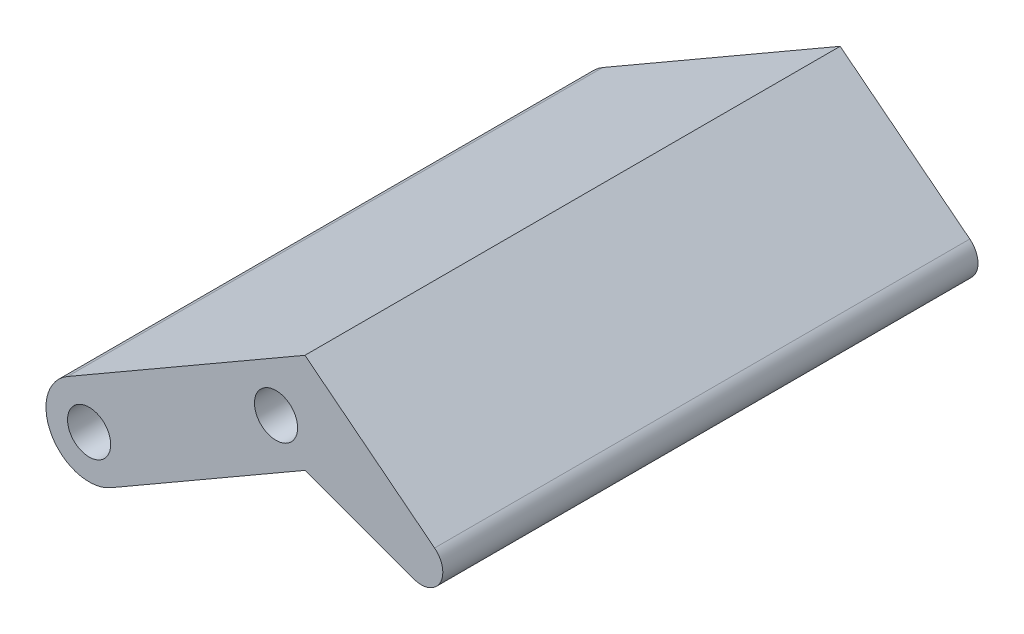
ISO-10303-21;
HEADER;
FILE_DESCRIPTION(('STEP AP214'),'2;1');
FILE_NAME('part.step','',(''),(''),'','','');
FILE_SCHEMA(('AUTOMOTIVE_DESIGN { 1 0 10303 214 1 1 1 1 }'));
ENDSEC;
DATA;
#1=APPLICATION_CONTEXT('core data for automotive mechanical design processes');
#2=APPLICATION_PROTOCOL_DEFINITION('international standard','automotive_design',2000,#1);
#3=PRODUCT_CONTEXT('',#1,'mechanical');
#4=PRODUCT('Part','Part','',(#3));
#5=PRODUCT_RELATED_PRODUCT_CATEGORY('part','',(#4));
#6=PRODUCT_DEFINITION_FORMATION('','',#4);
#7=PRODUCT_DEFINITION_CONTEXT('part definition',#1,'design');
#8=PRODUCT_DEFINITION('design','',#6,#7);
#9=PRODUCT_DEFINITION_SHAPE('','',#8);
#10=(LENGTH_UNIT() NAMED_UNIT(*) SI_UNIT(.MILLI.,.METRE.));
#11=(NAMED_UNIT(*) PLANE_ANGLE_UNIT() SI_UNIT($,.RADIAN.));
#12=(NAMED_UNIT(*) SI_UNIT($,.STERADIAN.) SOLID_ANGLE_UNIT());
#13=UNCERTAINTY_MEASURE_WITH_UNIT(LENGTH_MEASURE(1.E-05),#10,'distance_accuracy_value','');
#14=(GEOMETRIC_REPRESENTATION_CONTEXT(3) GLOBAL_UNCERTAINTY_ASSIGNED_CONTEXT((#13)) GLOBAL_UNIT_ASSIGNED_CONTEXT((#10,
#11,#12)) REPRESENTATION_CONTEXT('',''));
#15=CARTESIAN_POINT('',(0.,0.,0.));
#16=DIRECTION('',(0.,0.,1.));
#17=DIRECTION('',(1.,0.,0.));
#18=AXIS2_PLACEMENT_3D('',#15,#16,#17);
#19=CARTESIAN_POINT('',(-10.,40.7122492960801,70.));
#20=DIRECTION('',(0.,0.,-1.));
#21=DIRECTION('',(0.,1.,0.));
#22=AXIS2_PLACEMENT_3D('',#19,#20,#21);
#23=CYLINDRICAL_SURFACE('',#22,2.5);
#24=CARTESIAN_POINT('',(-10.,40.7122492960801,65.));
#25=DIRECTION('',(0.,0.,-1.));
#26=DIRECTION('',(0.,1.,0.));
#27=AXIS2_PLACEMENT_3D('',#24,#25,#26);
#28=CIRCLE('',#27,2.5);
#29=CARTESIAN_POINT('',(-10.,43.2122492960801,65.));
#30=VERTEX_POINT('',#29);
#31=EDGE_CURVE('E149',#30,#30,#28,.F.);
#32=ORIENTED_EDGE('',*,*,#31,.T.);
#33=EDGE_LOOP('',(#32));
#34=FACE_BOUND('',#33,.T.);
#35=CARTESIAN_POINT('',(-10.,40.71224929608,3.00000000000001));
#36=DIRECTION('',(0.,0.,-1.));
#37=DIRECTION('',(0.,1.,0.));
#38=AXIS2_PLACEMENT_3D('',#35,#36,#37);
#39=CIRCLE('',#38,2.5);
#40=CARTESIAN_POINT('',(-10.,43.2122492960801,3.00000000000001));
#41=VERTEX_POINT('',#40);
#42=EDGE_CURVE('E138',#41,#41,#39,.T.);
#43=ORIENTED_EDGE('',*,*,#42,.T.);
#44=EDGE_LOOP('',(#43));
#45=FACE_BOUND('',#44,.T.);
#46=ADVANCED_FACE('F63',(#34,#45),#23,.F.);
#47=CARTESIAN_POINT('',(11.650635094611,53.2122492960801,70.));
#48=DIRECTION('',(0.,0.,-1.));
#49=DIRECTION('',(0.,1.,0.));
#50=AXIS2_PLACEMENT_3D('',#47,#48,#49);
#51=CYLINDRICAL_SURFACE('',#50,2.5);
#52=CARTESIAN_POINT('',(11.650635094611,53.2122492960801,65.));
#53=DIRECTION('',(0.,0.,-1.));
#54=DIRECTION('',(0.,1.,0.));
#55=AXIS2_PLACEMENT_3D('',#52,#53,#54);
#56=CIRCLE('',#55,2.5);
#57=CARTESIAN_POINT('',(11.650635094611,55.7122492960801,65.));
#58=VERTEX_POINT('',#57);
#59=EDGE_CURVE('E119',#58,#58,#56,.F.);
#60=ORIENTED_EDGE('',*,*,#59,.T.);
#61=EDGE_LOOP('',(#60));
#62=FACE_BOUND('',#61,.T.);
#63=CARTESIAN_POINT('',(11.650635094611,53.21224929608,3.00000000000001));
#64=DIRECTION('',(0.,0.,-1.));
#65=DIRECTION('',(0.,1.,0.));
#66=AXIS2_PLACEMENT_3D('',#63,#64,#65);
#67=CIRCLE('',#66,2.5);
#68=CARTESIAN_POINT('',(11.650635094611,55.71224929608,3.00000000000001));
#69=VERTEX_POINT('',#68);
#70=EDGE_CURVE('E135',#69,#69,#67,.T.);
#71=ORIENTED_EDGE('',*,*,#70,.T.);
#72=EDGE_LOOP('',(#71));
#73=FACE_BOUND('',#72,.T.);
#74=ADVANCED_FACE('F196',(#62,#73),#51,.F.);
#75=CARTESIAN_POINT('',(28.4709591202086,47.1299196183413,-47.4283798145774));
#76=DIRECTION('',(0.,0.,1.));
#77=DIRECTION('',(0.,-1.,0.));
#78=AXIS2_PLACEMENT_3D('',#75,#76,#77);
#79=CYLINDRICAL_SURFACE('',#78,2.5);
#80=DIRECTION('',(0.,0.,1.));
#81=VECTOR('',#80,1.);
#82=CARTESIAN_POINT('',(27.6159087618944,44.7806880663766,-47.4283798145774));
#83=LINE('',#82,#81);
#84=CARTESIAN_POINT('',(27.6159087618944,44.7806880663766,3.00000000000001));
#85=VERTEX_POINT('',#84);
#86=CARTESIAN_POINT('',(27.6159087618944,44.7806880663766,65.));
#87=VERTEX_POINT('',#86);
#88=EDGE_CURVE('E109',#85,#87,#83,.T.);
#89=ORIENTED_EDGE('',*,*,#88,.F.);
#90=CARTESIAN_POINT('',(28.4709591202086,47.1299196183413,3.00000000000001));
#91=DIRECTION('',(0.,0.,-1.));
#92=DIRECTION('',(0.,1.,0.));
#93=AXIS2_PLACEMENT_3D('',#90,#91,#92);
#94=CIRCLE('',#93,2.5);
#95=CARTESIAN_POINT('',(30.0176059278044,49.094069218691,3.00000000000001));
#96=VERTEX_POINT('',#95);
#97=EDGE_CURVE('E113',#96,#85,#94,.T.);
#98=ORIENTED_EDGE('',*,*,#97,.F.);
#99=DIRECTION('',(0.,0.,1.));
#100=VECTOR('',#99,1.);
#101=CARTESIAN_POINT('',(30.0176059278044,49.094069218691,-47.4283798145774));
#102=LINE('',#101,#100);
#103=CARTESIAN_POINT('',(30.0176059278044,49.094069218691,65.));
#104=VERTEX_POINT('',#103);
#105=EDGE_CURVE('E78',#96,#104,#102,.T.);
#106=ORIENTED_EDGE('',*,*,#105,.T.);
#107=CARTESIAN_POINT('',(28.4709591202086,47.1299196183414,65.));
#108=DIRECTION('',(0.,0.,-1.));
#109=DIRECTION('',(0.,1.,0.));
#110=AXIS2_PLACEMENT_3D('',#107,#108,#109);
#111=CIRCLE('',#110,2.5);
#112=EDGE_CURVE('E114',#104,#87,#111,.T.);
#113=ORIENTED_EDGE('',*,*,#112,.T.);
#114=EDGE_LOOP('',(#89,#98,#106,#113));
#115=FACE_BOUND('',#114,.T.);
#116=ADVANCED_FACE('F111',(#115),#79,.T.);
#117=CARTESIAN_POINT('',(27.6159087618944,44.7806880663766,-47.4283798145774));
#118=DIRECTION('',(0.342020143325672,0.939692620785907,0.));
#119=DIRECTION('',(-0.939692620785907,0.342020143325672,0.));
#120=AXIS2_PLACEMENT_3D('',#117,#118,#119);
#121=PLANE('',#120);
#122=DIRECTION('',(0.,0.,1.));
#123=VECTOR('',#122,1.);
#124=CARTESIAN_POINT('',(15.,49.3725033339243,-47.4283798145774));
#125=LINE('',#124,#123);
#126=CARTESIAN_POINT('',(15.,49.3725033339244,3.00000000000001));
#127=VERTEX_POINT('',#126);
#128=CARTESIAN_POINT('',(15.,49.3725033339244,65.));
#129=VERTEX_POINT('',#128);
#130=EDGE_CURVE('E123',#127,#129,#125,.T.);
#131=ORIENTED_EDGE('',*,*,#130,.F.);
#132=DIRECTION('',(-0.939692620785907,0.342020143325672,0.));
#133=VECTOR('',#132,1.);
#134=CARTESIAN_POINT('',(27.6159087618944,44.7806880663766,3.00000000000001));
#135=LINE('',#134,#133);
#136=EDGE_CURVE('E121',#85,#127,#135,.T.);
#137=ORIENTED_EDGE('',*,*,#136,.F.);
#138=ORIENTED_EDGE('',*,*,#88,.T.);
#139=DIRECTION('',(-0.939692620785907,0.342020143325672,0.));
#140=VECTOR('',#139,1.);
#141=CARTESIAN_POINT('',(27.6159087618944,44.7806880663766,65.));
#142=LINE('',#141,#140);
#143=EDGE_CURVE('E118',#87,#129,#142,.T.);
#144=ORIENTED_EDGE('',*,*,#143,.T.);
#145=EDGE_LOOP('',(#131,#137,#138,#144));
#146=FACE_BOUND('',#145,.T.);
#147=ADVANCED_FACE('F65',(#146),#121,.F.);
#148=CARTESIAN_POINT('',(-10.,40.7122492960801,65.));
#149=DIRECTION('',(0.,0.,-1.));
#150=DIRECTION('',(0.,1.,0.));
#151=AXIS2_PLACEMENT_3D('',#148,#149,#150);
#152=PLANE('',#151);
#153=DIRECTION('',(-0.785659840139859,0.618658723038326,0.));
#154=VECTOR('',#153,1.);
#155=CARTESIAN_POINT('',(30.0176059278044,49.094069218691,65.));
#156=LINE('',#155,#154);
#157=CARTESIAN_POINT('',(15.,60.9195087177169,65.));
#158=VERTEX_POINT('',#157);
#159=EDGE_CURVE('E155',#104,#158,#156,.T.);
#160=ORIENTED_EDGE('',*,*,#159,.T.);
#161=DIRECTION('',(-0.86602540378444,-0.499999999999998,0.));
#162=VECTOR('',#161,1.);
#163=CARTESIAN_POINT('',(15.,60.9195087177169,65.));
#164=LINE('',#163,#162);
#165=CARTESIAN_POINT('',(-12.5,45.0423763150023,65.));
#166=VERTEX_POINT('',#165);
#167=EDGE_CURVE('E72',#158,#166,#164,.T.);
#168=ORIENTED_EDGE('',*,*,#167,.T.);
#169=CARTESIAN_POINT('',(-10.,40.7122492960801,65.));
#170=DIRECTION('',(0.,0.,-1.));
#171=DIRECTION('',(0.,1.,0.));
#172=AXIS2_PLACEMENT_3D('',#169,#170,#171);
#173=CIRCLE('',#172,5.);
#174=CARTESIAN_POINT('',(-7.50000000000003,36.3821222771579,65.));
#175=VERTEX_POINT('',#174);
#176=EDGE_CURVE('E12',#166,#175,#173,.F.);
#177=ORIENTED_EDGE('',*,*,#176,.T.);
#178=DIRECTION('',(-0.86602540378444,-0.499999999999997,0.));
#179=VECTOR('',#178,1.);
#180=CARTESIAN_POINT('',(15.,49.3725033339244,65.));
#181=LINE('',#180,#179);
#182=EDGE_CURVE('E159',#129,#175,#181,.T.);
#183=ORIENTED_EDGE('',*,*,#182,.F.);
#184=ORIENTED_EDGE('',*,*,#143,.F.);
#185=ORIENTED_EDGE('',*,*,#112,.F.);
#186=EDGE_LOOP('',(#160,#168,#177,#183,#184,#185));
#187=FACE_BOUND('',#186,.T.);
#188=ORIENTED_EDGE('',*,*,#59,.F.);
#189=EDGE_LOOP('',(#188));
#190=FACE_BOUND('',#189,.T.);
#191=ORIENTED_EDGE('',*,*,#31,.F.);
#192=EDGE_LOOP('',(#191));
#193=FACE_BOUND('',#192,.T.);
#194=ADVANCED_FACE('F181',(#187,#190,#193),#152,.F.);
#195=CARTESIAN_POINT('',(30.0176059278044,49.094069218691,-47.4283798145774));
#196=DIRECTION('',(0.618658723038326,0.785659840139859,0.));
#197=DIRECTION('',(-0.785659840139859,0.618658723038326,0.));
#198=AXIS2_PLACEMENT_3D('',#195,#196,#197);
#199=PLANE('',#198);
#200=ORIENTED_EDGE('',*,*,#105,.F.);
#201=DIRECTION('',(0.785659840139859,-0.618658723038326,0.));
#202=VECTOR('',#201,1.);
#203=CARTESIAN_POINT('',(15.,60.9195087177169,3.00000000000001));
#204=LINE('',#203,#202);
#205=CARTESIAN_POINT('',(15.,60.9195087177169,3.00000000000001));
#206=VERTEX_POINT('',#205);
#207=EDGE_CURVE('E134',#206,#96,#204,.T.);
#208=ORIENTED_EDGE('',*,*,#207,.F.);
#209=DIRECTION('',(0.,0.,1.));
#210=VECTOR('',#209,1.);
#211=CARTESIAN_POINT('',(15.,60.9195087177169,-47.4283798145774));
#212=LINE('',#211,#210);
#213=EDGE_CURVE('E170',#206,#158,#212,.T.);
#214=ORIENTED_EDGE('',*,*,#213,.T.);
#215=ORIENTED_EDGE('',*,*,#159,.F.);
#216=EDGE_LOOP('',(#200,#208,#214,#215));
#217=FACE_BOUND('',#216,.T.);
#218=ADVANCED_FACE('F175',(#217),#199,.T.);
#219=CARTESIAN_POINT('',(15.,60.9195087177169,-47.4283798145774));
#220=DIRECTION('',(-0.499999999999998,0.86602540378444,0.));
#221=DIRECTION('',(-0.86602540378444,-0.499999999999998,0.));
#222=AXIS2_PLACEMENT_3D('',#219,#220,#221);
#223=PLANE('',#222);
#224=ORIENTED_EDGE('',*,*,#213,.F.);
#225=DIRECTION('',(0.86602540378444,0.499999999999998,0.));
#226=VECTOR('',#225,1.);
#227=CARTESIAN_POINT('',(-12.5,45.0423763150023,3.00000000000001));
#228=LINE('',#227,#226);
#229=CARTESIAN_POINT('',(-12.5,45.0423763150023,3.00000000000001));
#230=VERTEX_POINT('',#229);
#231=EDGE_CURVE('E146',#230,#206,#228,.T.);
#232=ORIENTED_EDGE('',*,*,#231,.F.);
#233=DIRECTION('',(0.,0.,1.));
#234=VECTOR('',#233,1.);
#235=CARTESIAN_POINT('',(-12.5,45.0423763150022,-47.4283798145774));
#236=LINE('',#235,#234);
#237=EDGE_CURVE('E167',#230,#166,#236,.T.);
#238=ORIENTED_EDGE('',*,*,#237,.T.);
#239=ORIENTED_EDGE('',*,*,#167,.F.);
#240=EDGE_LOOP('',(#224,#232,#238,#239));
#241=FACE_BOUND('',#240,.T.);
#242=ADVANCED_FACE('F178',(#241),#223,.T.);
#243=CARTESIAN_POINT('',(-10.,40.71224929608,-47.4283798145774));
#244=DIRECTION('',(0.,0.,1.));
#245=DIRECTION('',(0.,-1.,0.));
#246=AXIS2_PLACEMENT_3D('',#243,#244,#245);
#247=CYLINDRICAL_SURFACE('',#246,5.);
#248=ORIENTED_EDGE('',*,*,#237,.F.);
#249=CARTESIAN_POINT('',(-10.,40.71224929608,3.00000000000001));
#250=DIRECTION('',(0.,0.,-1.));
#251=DIRECTION('',(0.,1.,0.));
#252=AXIS2_PLACEMENT_3D('',#249,#250,#251);
#253=CIRCLE('',#252,5.);
#254=CARTESIAN_POINT('',(-7.50000000000003,36.3821222771578,3.00000000000001));
#255=VERTEX_POINT('',#254);
#256=EDGE_CURVE('E143',#255,#230,#253,.T.);
#257=ORIENTED_EDGE('',*,*,#256,.F.);
#258=DIRECTION('',(0.,0.,1.));
#259=VECTOR('',#258,1.);
#260=CARTESIAN_POINT('',(-7.50000000000003,36.3821222771578,-47.4283798145774));
#261=LINE('',#260,#259);
#262=EDGE_CURVE('E162',#255,#175,#261,.T.);
#263=ORIENTED_EDGE('',*,*,#262,.T.);
#264=ORIENTED_EDGE('',*,*,#176,.F.);
#265=EDGE_LOOP('',(#248,#257,#263,#264));
#266=FACE_BOUND('',#265,.T.);
#267=ADVANCED_FACE('F187',(#266),#247,.T.);
#268=CARTESIAN_POINT('',(15.,49.3725033339243,-47.4283798145774));
#269=DIRECTION('',(-0.499999999999997,0.86602540378444,0.));
#270=DIRECTION('',(-0.86602540378444,-0.499999999999997,0.));
#271=AXIS2_PLACEMENT_3D('',#268,#269,#270);
#272=PLANE('',#271);
#273=ORIENTED_EDGE('',*,*,#262,.F.);
#274=DIRECTION('',(-0.86602540378444,-0.499999999999998,0.));
#275=VECTOR('',#274,1.);
#276=CARTESIAN_POINT('',(15.,49.3725033339244,3.00000000000001));
#277=LINE('',#276,#275);
#278=EDGE_CURVE('E127',#127,#255,#277,.T.);
#279=ORIENTED_EDGE('',*,*,#278,.F.);
#280=ORIENTED_EDGE('',*,*,#130,.T.);
#281=ORIENTED_EDGE('',*,*,#182,.T.);
#282=EDGE_LOOP('',(#273,#279,#280,#281));
#283=FACE_BOUND('',#282,.T.);
#284=ADVANCED_FACE('F184',(#283),#272,.F.);
#285=CARTESIAN_POINT('',(28.4709591202086,47.1299196183413,3.00000000000001));
#286=DIRECTION('',(0.,0.,-1.));
#287=DIRECTION('',(0.,1.,0.));
#288=AXIS2_PLACEMENT_3D('',#285,#286,#287);
#289=PLANE('',#288);
#290=ORIENTED_EDGE('',*,*,#70,.F.);
#291=EDGE_LOOP('',(#290));
#292=FACE_BOUND('',#291,.T.);
#293=ORIENTED_EDGE('',*,*,#97,.T.);
#294=ORIENTED_EDGE('',*,*,#136,.T.);
#295=ORIENTED_EDGE('',*,*,#278,.T.);
#296=ORIENTED_EDGE('',*,*,#256,.T.);
#297=ORIENTED_EDGE('',*,*,#231,.T.);
#298=ORIENTED_EDGE('',*,*,#207,.T.);
#299=EDGE_LOOP('',(#293,#294,#295,#296,#297,#298));
#300=FACE_BOUND('',#299,.T.);
#301=ORIENTED_EDGE('',*,*,#42,.F.);
#302=EDGE_LOOP('',(#301));
#303=FACE_BOUND('',#302,.T.);
#304=ADVANCED_FACE('F130',(#292,#300,#303),#289,.T.);
#305=CLOSED_SHELL('',(#46,#74,#116,#147,#194,#218,#242,#267,#284,#304));
#306=MANIFOLD_SOLID_BREP('B2',#305);
#307=ADVANCED_BREP_SHAPE_REPRESENTATION('',(#18,#306),#14);
#308=SHAPE_DEFINITION_REPRESENTATION(#9,#307);
ENDSEC;
END-ISO-10303-21;
